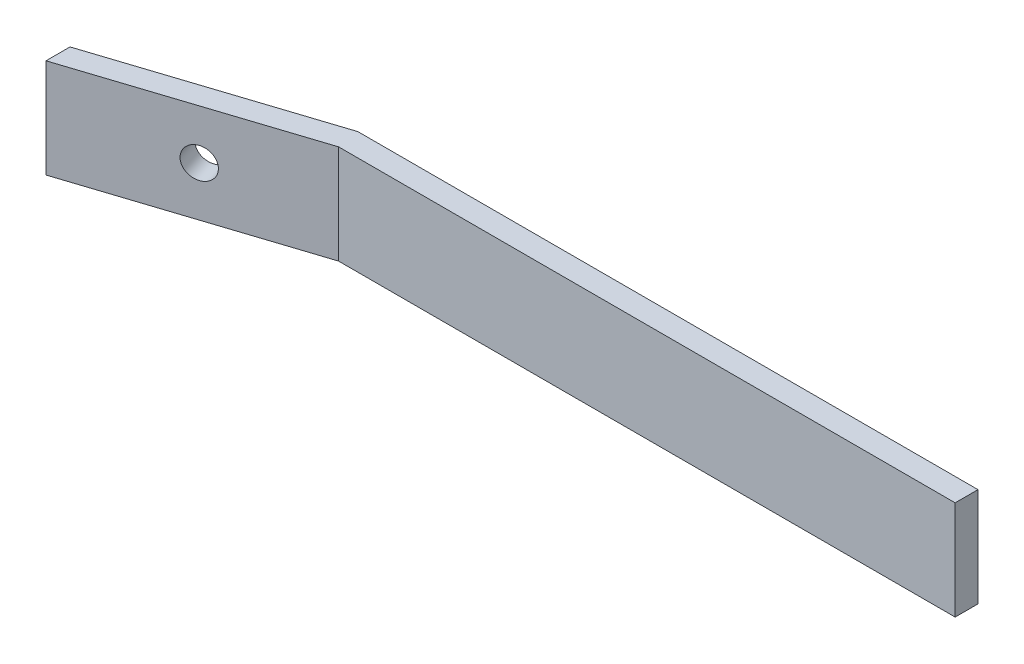
ISO-10303-21;
HEADER;
FILE_DESCRIPTION(('STEP AP214'),'2;1');
FILE_NAME('part.step','',(''),(''),'','','');
FILE_SCHEMA(('AUTOMOTIVE_DESIGN { 1 0 10303 214 1 1 1 1 }'));
ENDSEC;
DATA;
#1=APPLICATION_CONTEXT('core data for automotive mechanical design processes');
#2=APPLICATION_PROTOCOL_DEFINITION('international standard','automotive_design',2000,#1);
#3=PRODUCT_CONTEXT('',#1,'mechanical');
#4=PRODUCT('Part','Part','',(#3));
#5=PRODUCT_RELATED_PRODUCT_CATEGORY('part','',(#4));
#6=PRODUCT_DEFINITION_FORMATION('','',#4);
#7=PRODUCT_DEFINITION_CONTEXT('part definition',#1,'design');
#8=PRODUCT_DEFINITION('design','',#6,#7);
#9=PRODUCT_DEFINITION_SHAPE('','',#8);
#10=(LENGTH_UNIT() NAMED_UNIT(*) SI_UNIT(.MILLI.,.METRE.));
#11=(NAMED_UNIT(*) PLANE_ANGLE_UNIT() SI_UNIT($,.RADIAN.));
#12=(NAMED_UNIT(*) SI_UNIT($,.STERADIAN.) SOLID_ANGLE_UNIT());
#13=UNCERTAINTY_MEASURE_WITH_UNIT(LENGTH_MEASURE(1.E-05),#10,'distance_accuracy_value','');
#14=(GEOMETRIC_REPRESENTATION_CONTEXT(3) GLOBAL_UNCERTAINTY_ASSIGNED_CONTEXT((#13)) GLOBAL_UNIT_ASSIGNED_CONTEXT((#10,
#11,#12)) REPRESENTATION_CONTEXT('',''));
#15=CARTESIAN_POINT('',(0.,0.,0.));
#16=DIRECTION('',(0.,0.,1.));
#17=DIRECTION('',(1.,0.,0.));
#18=AXIS2_PLACEMENT_3D('',#15,#16,#17);
#19=CARTESIAN_POINT('',(-75.0000000000002,6.50000000000001,40.));
#20=DIRECTION('',(0.,-1.,0.));
#21=DIRECTION('',(0.,0.,-1.));
#22=AXIS2_PLACEMENT_3D('',#19,#20,#21);
#23=PLANE('',#22);
#24=DIRECTION('',(0.,0.,-1.));
#25=VECTOR('',#24,1.);
#26=CARTESIAN_POINT('',(34.9999999999998,6.5,12.4248965039633));
#27=LINE('',#26,#25);
#28=CARTESIAN_POINT('',(34.9999999999998,6.50000000000001,2.99999999999999));
#29=VERTEX_POINT('',#28);
#30=CARTESIAN_POINT('',(34.9999999999998,6.5,0.));
#31=VERTEX_POINT('',#30);
#32=EDGE_CURVE('E50',#29,#31,#27,.T.);
#33=ORIENTED_EDGE('',*,*,#32,.T.);
#34=DIRECTION('',(-1.,0.,0.));
#35=VECTOR('',#34,1.);
#36=CARTESIAN_POINT('',(-75.0000000000002,6.50000000000001,0.));
#37=LINE('',#36,#35);
#38=CARTESIAN_POINT('',(-46.4683045111456,6.50000000000001,0.));
#39=VERTEX_POINT('',#38);
#40=EDGE_CURVE('E99',#31,#39,#37,.T.);
#41=ORIENTED_EDGE('',*,*,#40,.T.);
#42=DIRECTION('',(-0.951056516295153,0.,0.309016994374949));
#43=VECTOR('',#42,1.);
#44=CARTESIAN_POINT('',(-84.0311705658295,6.50000000000001,12.2049150281253));
#45=LINE('',#44,#43);
#46=CARTESIAN_POINT('',(-75.0000000000002,6.50000000000001,9.27050983124846));
#47=VERTEX_POINT('',#46);
#48=EDGE_CURVE('E109',#39,#47,#45,.T.);
#49=ORIENTED_EDGE('',*,*,#48,.T.);
#50=DIRECTION('',(0.,0.,-1.));
#51=VECTOR('',#50,1.);
#52=CARTESIAN_POINT('',(-75.0000000000002,6.50000000000001,40.));
#53=LINE('',#52,#51);
#54=CARTESIAN_POINT('',(-75.0000000000002,6.50000000000001,12.4248965039633));
#55=VERTEX_POINT('',#54);
#56=EDGE_CURVE('E118',#55,#47,#53,.T.);
#57=ORIENTED_EDGE('',*,*,#56,.F.);
#58=DIRECTION('',(0.951056516295153,0.,-0.309016994374949));
#59=VECTOR('',#58,1.);
#60=CARTESIAN_POINT('',(-75.0000000000002,6.50000000000001,12.4248965039633));
#61=LINE('',#60,#59);
#62=CARTESIAN_POINT('',(-45.993151190172,6.50000000000001,2.99999999999999));
#63=VERTEX_POINT('',#62);
#64=EDGE_CURVE('E133',#55,#63,#61,.T.);
#65=ORIENTED_EDGE('',*,*,#64,.T.);
#66=DIRECTION('',(1.,0.,0.));
#67=VECTOR('',#66,1.);
#68=CARTESIAN_POINT('',(74.9999999999998,6.50000000000001,3.));
#69=LINE('',#68,#67);
#70=EDGE_CURVE('E103',#63,#29,#69,.T.);
#71=ORIENTED_EDGE('',*,*,#70,.T.);
#72=EDGE_LOOP('',(#33,#41,#49,#57,#65,#71));
#73=FACE_BOUND('',#72,.T.);
#74=ADVANCED_FACE('F37',(#73),#23,.F.);
#75=CARTESIAN_POINT('',(-75.0000000000002,-6.49999999999999,40.));
#76=DIRECTION('',(0.,1.,0.));
#77=DIRECTION('',(0.,0.,1.));
#78=AXIS2_PLACEMENT_3D('',#75,#76,#77);
#79=PLANE('',#78);
#80=DIRECTION('',(0.,0.,-1.));
#81=VECTOR('',#80,1.);
#82=CARTESIAN_POINT('',(34.9999999999998,-6.5,12.4248965039633));
#83=LINE('',#82,#81);
#84=CARTESIAN_POINT('',(34.9999999999998,-6.5,3.));
#85=VERTEX_POINT('',#84);
#86=CARTESIAN_POINT('',(34.9999999999998,-6.5,0.));
#87=VERTEX_POINT('',#86);
#88=EDGE_CURVE('E90',#85,#87,#83,.T.);
#89=ORIENTED_EDGE('',*,*,#88,.F.);
#90=DIRECTION('',(1.,0.,0.));
#91=VECTOR('',#90,1.);
#92=CARTESIAN_POINT('',(74.9999999999998,-6.49999999999999,3.));
#93=LINE('',#92,#91);
#94=CARTESIAN_POINT('',(-45.993151190172,-6.49999999999999,2.99999999999999));
#95=VERTEX_POINT('',#94);
#96=EDGE_CURVE('E125',#95,#85,#93,.T.);
#97=ORIENTED_EDGE('',*,*,#96,.F.);
#98=DIRECTION('',(0.951056516295153,0.,-0.309016994374949));
#99=VECTOR('',#98,1.);
#100=CARTESIAN_POINT('',(-75.0000000000002,-6.49999999999999,12.4248965039633));
#101=LINE('',#100,#99);
#102=CARTESIAN_POINT('',(-75.0000000000002,-6.49999999999999,12.4248965039633));
#103=VERTEX_POINT('',#102);
#104=EDGE_CURVE('E122',#103,#95,#101,.T.);
#105=ORIENTED_EDGE('',*,*,#104,.F.);
#106=DIRECTION('',(0.,0.,-1.));
#107=VECTOR('',#106,1.);
#108=CARTESIAN_POINT('',(-75.0000000000002,-6.49999999999999,40.));
#109=LINE('',#108,#107);
#110=CARTESIAN_POINT('',(-75.0000000000002,-6.49999999999999,9.27050983124846));
#111=VERTEX_POINT('',#110);
#112=EDGE_CURVE('E111',#103,#111,#109,.T.);
#113=ORIENTED_EDGE('',*,*,#112,.T.);
#114=DIRECTION('',(-0.951056516295153,0.,0.309016994374949));
#115=VECTOR('',#114,1.);
#116=CARTESIAN_POINT('',(-75.0000000000002,-6.49999999999999,9.27050983124846));
#117=LINE('',#116,#115);
#118=CARTESIAN_POINT('',(-46.4683045111456,-6.49999999999999,0.));
#119=VERTEX_POINT('',#118);
#120=EDGE_CURVE('E140',#119,#111,#117,.T.);
#121=ORIENTED_EDGE('',*,*,#120,.F.);
#122=DIRECTION('',(1.,0.,0.));
#123=VECTOR('',#122,1.);
#124=CARTESIAN_POINT('',(-75.0000000000002,-6.49999999999999,0.));
#125=LINE('',#124,#123);
#126=EDGE_CURVE('E108',#119,#87,#125,.T.);
#127=ORIENTED_EDGE('',*,*,#126,.T.);
#128=EDGE_LOOP('',(#89,#97,#105,#113,#121,#127));
#129=FACE_BOUND('',#128,.T.);
#130=ADVANCED_FACE('F157',(#129),#79,.F.);
#131=CARTESIAN_POINT('',(0.,0.,0.));
#132=DIRECTION('',(0.,0.,1.));
#133=DIRECTION('',(1.,0.,0.));
#134=AXIS2_PLACEMENT_3D('',#131,#132,#133);
#135=PLANE('',#134);
#136=DIRECTION('',(0.,-1.,0.));
#137=VECTOR('',#136,1.);
#138=CARTESIAN_POINT('',(34.9999999999998,6.5,0.));
#139=LINE('',#138,#137);
#140=EDGE_CURVE('E87',#31,#87,#139,.T.);
#141=ORIENTED_EDGE('',*,*,#140,.T.);
#142=ORIENTED_EDGE('',*,*,#126,.F.);
#143=DIRECTION('',(0.,1.,0.));
#144=VECTOR('',#143,1.);
#145=CARTESIAN_POINT('',(-46.4683045111456,0.,0.));
#146=LINE('',#145,#144);
#147=EDGE_CURVE('E44',#119,#39,#146,.T.);
#148=ORIENTED_EDGE('',*,*,#147,.T.);
#149=ORIENTED_EDGE('',*,*,#40,.F.);
#150=EDGE_LOOP('',(#141,#142,#148,#149));
#151=FACE_BOUND('',#150,.T.);
#152=ADVANCED_FACE('F107',(#151),#135,.F.);
#153=CARTESIAN_POINT('',(74.9999999999998,6.50000000000001,3.));
#154=DIRECTION('',(0.,0.,-1.));
#155=DIRECTION('',(-1.,0.,0.));
#156=AXIS2_PLACEMENT_3D('',#153,#154,#155);
#157=PLANE('',#156);
#158=DIRECTION('',(0.,-1.,0.));
#159=VECTOR('',#158,1.);
#160=CARTESIAN_POINT('',(34.9999999999998,6.50000000000001,2.99999999999999));
#161=LINE('',#160,#159);
#162=EDGE_CURVE('E11',#29,#85,#161,.T.);
#163=ORIENTED_EDGE('',*,*,#162,.F.);
#164=ORIENTED_EDGE('',*,*,#70,.F.);
#165=DIRECTION('',(0.,-1.,0.));
#166=VECTOR('',#165,1.);
#167=CARTESIAN_POINT('',(-45.993151190172,6.50000000000001,2.99999999999999));
#168=LINE('',#167,#166);
#169=EDGE_CURVE('E138',#63,#95,#168,.T.);
#170=ORIENTED_EDGE('',*,*,#169,.T.);
#171=ORIENTED_EDGE('',*,*,#96,.T.);
#172=EDGE_LOOP('',(#163,#164,#170,#171));
#173=FACE_BOUND('',#172,.T.);
#174=ADVANCED_FACE('F155',(#173),#157,.F.);
#175=CARTESIAN_POINT('',(-75.0000000000002,6.50000000000001,40.));
#176=DIRECTION('',(1.,0.,0.));
#177=DIRECTION('',(0.,1.,0.));
#178=AXIS2_PLACEMENT_3D('',#175,#176,#177);
#179=PLANE('',#178);
#180=ORIENTED_EDGE('',*,*,#112,.F.);
#181=DIRECTION('',(0.,-1.,0.));
#182=VECTOR('',#181,1.);
#183=CARTESIAN_POINT('',(-75.0000000000002,6.50000000000001,12.4248965039633));
#184=LINE('',#183,#182);
#185=EDGE_CURVE('E58',#55,#103,#184,.T.);
#186=ORIENTED_EDGE('',*,*,#185,.F.);
#187=ORIENTED_EDGE('',*,*,#56,.T.);
#188=DIRECTION('',(0.,-1.,0.));
#189=VECTOR('',#188,1.);
#190=CARTESIAN_POINT('',(-75.0000000000002,33.5,9.27050983124846));
#191=LINE('',#190,#189);
#192=EDGE_CURVE('E113',#47,#111,#191,.T.);
#193=ORIENTED_EDGE('',*,*,#192,.T.);
#194=EDGE_LOOP('',(#180,#186,#187,#193));
#195=FACE_BOUND('',#194,.T.);
#196=ADVANCED_FACE('F147',(#195),#179,.F.);
#197=CARTESIAN_POINT('',(-75.0000000000002,33.5,9.27050983124846));
#198=DIRECTION('',(0.309016994374949,0.,0.951056516295153));
#199=DIRECTION('',(0.951056516295153,0.,-0.309016994374949));
#200=AXIS2_PLACEMENT_3D('',#197,#198,#199);
#201=PLANE('',#200);
#202=CARTESIAN_POINT('',(-60.7341522555729,0.,4.63525491562423));
#203=DIRECTION('',(-0.309016994374949,0.,-0.951056516295153));
#204=DIRECTION('',(-0.951056516295153,0.,0.309016994374949));
#205=AXIS2_PLACEMENT_3D('',#202,#203,#204);
#206=CIRCLE('',#205,1.99999999999999);
#207=CARTESIAN_POINT('',(-62.6362652881632,0.,5.25328890437412));
#208=VERTEX_POINT('',#207);
#209=EDGE_CURVE('E104',#208,#208,#206,.T.);
#210=ORIENTED_EDGE('',*,*,#209,.F.);
#211=EDGE_LOOP('',(#210));
#212=FACE_BOUND('',#211,.T.);
#213=ORIENTED_EDGE('',*,*,#147,.F.);
#214=ORIENTED_EDGE('',*,*,#120,.T.);
#215=ORIENTED_EDGE('',*,*,#192,.F.);
#216=ORIENTED_EDGE('',*,*,#48,.F.);
#217=EDGE_LOOP('',(#213,#214,#215,#216));
#218=FACE_BOUND('',#217,.T.);
#219=ADVANCED_FACE('F150',(#212,#218),#201,.F.);
#220=CARTESIAN_POINT('',(-75.0000000000002,6.50000000000001,12.4248965039633));
#221=DIRECTION('',(-0.309016994374949,0.,-0.951056516295153));
#222=DIRECTION('',(-0.951056516295153,0.,0.309016994374949));
#223=AXIS2_PLACEMENT_3D('',#220,#221,#222);
#224=PLANE('',#223);
#225=CARTESIAN_POINT('',(-59.807101272448,0.,7.48842446450968));
#226=DIRECTION('',(-0.309016994374949,0.,-0.951056516295153));
#227=DIRECTION('',(-0.951056516295153,0.,0.309016994374949));
#228=AXIS2_PLACEMENT_3D('',#225,#226,#227);
#229=CIRCLE('',#228,1.99999999999999);
#230=CARTESIAN_POINT('',(-61.7092143050383,0.,8.10645845325958));
#231=VERTEX_POINT('',#230);
#232=EDGE_CURVE('E120',#231,#231,#229,.T.);
#233=ORIENTED_EDGE('',*,*,#232,.T.);
#234=EDGE_LOOP('',(#233));
#235=FACE_BOUND('',#234,.T.);
#236=ORIENTED_EDGE('',*,*,#104,.T.);
#237=ORIENTED_EDGE('',*,*,#169,.F.);
#238=ORIENTED_EDGE('',*,*,#64,.F.);
#239=ORIENTED_EDGE('',*,*,#185,.T.);
#240=EDGE_LOOP('',(#236,#237,#238,#239));
#241=FACE_BOUND('',#240,.T.);
#242=ADVANCED_FACE('F152',(#235,#241),#224,.F.);
#243=CARTESIAN_POINT('',(-58.7255417921357,0.,10.8171222715427));
#244=DIRECTION('',(-0.309016994374949,0.,-0.951056516295153));
#245=DIRECTION('',(-0.951056516295153,0.,0.309016994374949));
#246=AXIS2_PLACEMENT_3D('',#243,#244,#245);
#247=CYLINDRICAL_SURFACE('',#246,1.99999999999999);
#248=ORIENTED_EDGE('',*,*,#209,.T.);
#249=EDGE_LOOP('',(#248));
#250=FACE_BOUND('',#249,.T.);
#251=ORIENTED_EDGE('',*,*,#232,.F.);
#252=EDGE_LOOP('',(#251));
#253=FACE_BOUND('',#252,.T.);
#254=ADVANCED_FACE('F177',(#250,#253),#247,.F.);
#255=CARTESIAN_POINT('',(34.9999999999998,6.5,12.4248965039633));
#256=DIRECTION('',(1.,0.,0.));
#257=DIRECTION('',(0.,0.,-1.));
#258=AXIS2_PLACEMENT_3D('',#255,#256,#257);
#259=PLANE('',#258);
#260=ORIENTED_EDGE('',*,*,#162,.T.);
#261=ORIENTED_EDGE('',*,*,#88,.T.);
#262=ORIENTED_EDGE('',*,*,#140,.F.);
#263=ORIENTED_EDGE('',*,*,#32,.F.);
#264=EDGE_LOOP('',(#260,#261,#262,#263));
#265=FACE_BOUND('',#264,.T.);
#266=ADVANCED_FACE('F88',(#265),#259,.T.);
#267=CLOSED_SHELL('',(#74,#130,#152,#174,#196,#219,#242,#254,#266));
#268=MANIFOLD_SOLID_BREP('B2',#267);
#269=ADVANCED_BREP_SHAPE_REPRESENTATION('',(#18,#268),#14);
#270=SHAPE_DEFINITION_REPRESENTATION(#9,#269);
ENDSEC;
END-ISO-10303-21;
